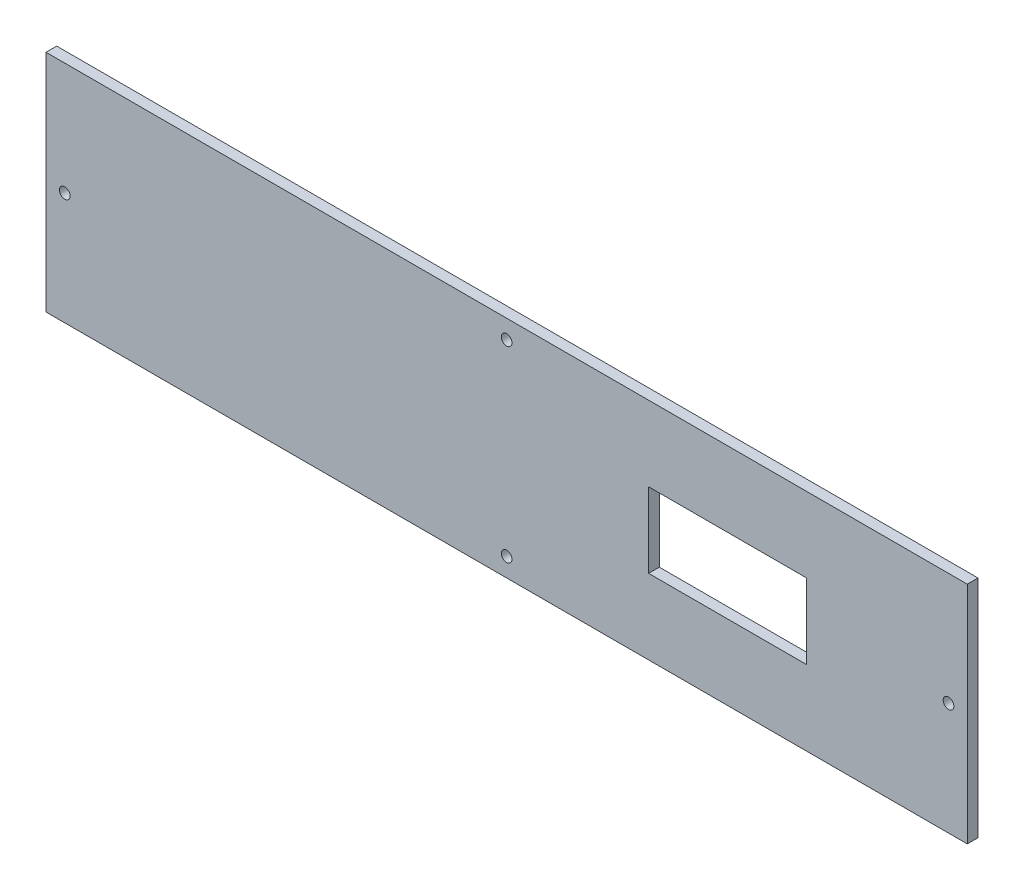
ISO-10303-21;
HEADER;
FILE_DESCRIPTION(('STEP AP214'),'2;1');
FILE_NAME('part.step','',(''),(''),'','','');
FILE_SCHEMA(('AUTOMOTIVE_DESIGN { 1 0 10303 214 1 1 1 1 }'));
ENDSEC;
DATA;
#1=APPLICATION_CONTEXT('core data for automotive mechanical design processes');
#2=APPLICATION_PROTOCOL_DEFINITION('international standard','automotive_design',2000,#1);
#3=PRODUCT_CONTEXT('',#1,'mechanical');
#4=PRODUCT('Part','Part','',(#3));
#5=PRODUCT_RELATED_PRODUCT_CATEGORY('part','',(#4));
#6=PRODUCT_DEFINITION_FORMATION('','',#4);
#7=PRODUCT_DEFINITION_CONTEXT('part definition',#1,'design');
#8=PRODUCT_DEFINITION('design','',#6,#7);
#9=PRODUCT_DEFINITION_SHAPE('','',#8);
#10=(LENGTH_UNIT() NAMED_UNIT(*) SI_UNIT(.MILLI.,.METRE.));
#11=(NAMED_UNIT(*) PLANE_ANGLE_UNIT() SI_UNIT($,.RADIAN.));
#12=(NAMED_UNIT(*) SI_UNIT($,.STERADIAN.) SOLID_ANGLE_UNIT());
#13=UNCERTAINTY_MEASURE_WITH_UNIT(LENGTH_MEASURE(1.E-05),#10,'distance_accuracy_value','');
#14=(GEOMETRIC_REPRESENTATION_CONTEXT(3) GLOBAL_UNCERTAINTY_ASSIGNED_CONTEXT((#13)) GLOBAL_UNIT_ASSIGNED_CONTEXT((#10,
#11,#12)) REPRESENTATION_CONTEXT('',''));
#15=CARTESIAN_POINT('',(0.,0.,0.));
#16=DIRECTION('',(0.,0.,1.));
#17=DIRECTION('',(1.,0.,0.));
#18=AXIS2_PLACEMENT_3D('',#15,#16,#17);
#19=CARTESIAN_POINT('',(0.,0.,4.));
#20=DIRECTION('',(0.,0.,-1.));
#21=DIRECTION('',(-1.,0.,0.));
#22=AXIS2_PLACEMENT_3D('',#19,#20,#21);
#23=PLANE('',#22);
#24=CARTESIAN_POINT('',(337.,42.,4.));
#25=DIRECTION('',(0.,0.,1.));
#26=DIRECTION('',(1.,0.,0.));
#27=AXIS2_PLACEMENT_3D('',#24,#25,#26);
#28=CIRCLE('',#27,2.);
#29=CARTESIAN_POINT('',(339.,42.,4.));
#30=VERTEX_POINT('',#29);
#31=EDGE_CURVE('E138',#30,#30,#28,.T.);
#32=ORIENTED_EDGE('',*,*,#31,.F.);
#33=EDGE_LOOP('',(#32));
#34=FACE_BOUND('',#33,.T.);
#35=CARTESIAN_POINT('',(172.,77.,4.));
#36=DIRECTION('',(0.,0.,1.));
#37=DIRECTION('',(1.,0.,0.));
#38=AXIS2_PLACEMENT_3D('',#35,#36,#37);
#39=CIRCLE('',#38,2.);
#40=CARTESIAN_POINT('',(174.,77.,4.));
#41=VERTEX_POINT('',#40);
#42=EDGE_CURVE('E150',#41,#41,#39,.T.);
#43=ORIENTED_EDGE('',*,*,#42,.F.);
#44=EDGE_LOOP('',(#43));
#45=FACE_BOUND('',#44,.T.);
#46=DIRECTION('',(1.,0.,0.));
#47=VECTOR('',#46,1.);
#48=CARTESIAN_POINT('',(344.,0.,4.));
#49=LINE('',#48,#47);
#50=CARTESIAN_POINT('',(0.,0.,4.));
#51=VERTEX_POINT('',#50);
#52=CARTESIAN_POINT('',(344.,0.,4.));
#53=VERTEX_POINT('',#52);
#54=EDGE_CURVE('E162',#51,#53,#49,.T.);
#55=ORIENTED_EDGE('',*,*,#54,.T.);
#56=DIRECTION('',(0.,1.,0.));
#57=VECTOR('',#56,1.);
#58=CARTESIAN_POINT('',(344.,84.,4.));
#59=LINE('',#58,#57);
#60=CARTESIAN_POINT('',(344.,84.,4.));
#61=VERTEX_POINT('',#60);
#62=EDGE_CURVE('E165',#53,#61,#59,.T.);
#63=ORIENTED_EDGE('',*,*,#62,.T.);
#64=DIRECTION('',(-1.,0.,0.));
#65=VECTOR('',#64,1.);
#66=CARTESIAN_POINT('',(0.,84.,4.));
#67=LINE('',#66,#65);
#68=CARTESIAN_POINT('',(0.,84.,4.));
#69=VERTEX_POINT('',#68);
#70=EDGE_CURVE('E168',#61,#69,#67,.T.);
#71=ORIENTED_EDGE('',*,*,#70,.T.);
#72=DIRECTION('',(0.,-1.,0.));
#73=VECTOR('',#72,1.);
#74=CARTESIAN_POINT('',(0.,0.,4.));
#75=LINE('',#74,#73);
#76=EDGE_CURVE('E170',#69,#51,#75,.T.);
#77=ORIENTED_EDGE('',*,*,#76,.T.);
#78=EDGE_LOOP('',(#55,#63,#71,#77));
#79=FACE_BOUND('',#78,.T.);
#80=CARTESIAN_POINT('',(7.,42.,4.));
#81=DIRECTION('',(0.,0.,1.));
#82=DIRECTION('',(1.,0.,0.));
#83=AXIS2_PLACEMENT_3D('',#80,#81,#82);
#84=CIRCLE('',#83,2.);
#85=CARTESIAN_POINT('',(9.,42.,4.));
#86=VERTEX_POINT('',#85);
#87=EDGE_CURVE('E156',#86,#86,#84,.T.);
#88=ORIENTED_EDGE('',*,*,#87,.F.);
#89=EDGE_LOOP('',(#88));
#90=FACE_BOUND('',#89,.T.);
#91=CARTESIAN_POINT('',(172.,7.00000000000001,4.));
#92=DIRECTION('',(0.,0.,1.));
#93=DIRECTION('',(1.,0.,0.));
#94=AXIS2_PLACEMENT_3D('',#91,#92,#93);
#95=CIRCLE('',#94,2.);
#96=CARTESIAN_POINT('',(174.,7.00000000000001,4.));
#97=VERTEX_POINT('',#96);
#98=EDGE_CURVE('E144',#97,#97,#95,.T.);
#99=ORIENTED_EDGE('',*,*,#98,.F.);
#100=EDGE_LOOP('',(#99));
#101=FACE_BOUND('',#100,.T.);
#102=DIRECTION('',(-1.,0.,0.));
#103=VECTOR('',#102,1.);
#104=CARTESIAN_POINT('',(284.,56.,4.));
#105=LINE('',#104,#103);
#106=CARTESIAN_POINT('',(284.,56.,4.));
#107=VERTEX_POINT('',#106);
#108=CARTESIAN_POINT('',(225.,56.,4.));
#109=VERTEX_POINT('',#108);
#110=EDGE_CURVE('E102',#107,#109,#105,.T.);
#111=ORIENTED_EDGE('',*,*,#110,.F.);
#112=DIRECTION('',(0.,1.,0.));
#113=VECTOR('',#112,1.);
#114=CARTESIAN_POINT('',(284.,28.,4.));
#115=LINE('',#114,#113);
#116=CARTESIAN_POINT('',(284.,28.,4.));
#117=VERTEX_POINT('',#116);
#118=EDGE_CURVE('E124',#117,#107,#115,.T.);
#119=ORIENTED_EDGE('',*,*,#118,.F.);
#120=DIRECTION('',(1.,0.,0.));
#121=VECTOR('',#120,1.);
#122=CARTESIAN_POINT('',(225.,28.,4.));
#123=LINE('',#122,#121);
#124=CARTESIAN_POINT('',(225.,28.,4.));
#125=VERTEX_POINT('',#124);
#126=EDGE_CURVE('E122',#125,#117,#123,.T.);
#127=ORIENTED_EDGE('',*,*,#126,.F.);
#128=DIRECTION('',(0.,-1.,0.));
#129=VECTOR('',#128,1.);
#130=CARTESIAN_POINT('',(225.,56.,4.));
#131=LINE('',#130,#129);
#132=EDGE_CURVE('E110',#109,#125,#131,.T.);
#133=ORIENTED_EDGE('',*,*,#132,.F.);
#134=EDGE_LOOP('',(#111,#119,#127,#133));
#135=FACE_BOUND('',#134,.T.);
#136=ADVANCED_FACE('F37',(#34,#45,#79,#90,#101,#135),#23,.F.);
#137=CARTESIAN_POINT('',(0.,0.,0.));
#138=DIRECTION('',(0.,0.,-1.));
#139=DIRECTION('',(-1.,0.,0.));
#140=AXIS2_PLACEMENT_3D('',#137,#138,#139);
#141=PLANE('',#140);
#142=CARTESIAN_POINT('',(337.,42.,0.));
#143=DIRECTION('',(0.,0.,1.));
#144=DIRECTION('',(1.,0.,0.));
#145=AXIS2_PLACEMENT_3D('',#142,#143,#144);
#146=CIRCLE('',#145,2.);
#147=CARTESIAN_POINT('',(339.,42.,0.));
#148=VERTEX_POINT('',#147);
#149=EDGE_CURVE('E118',#148,#148,#146,.T.);
#150=ORIENTED_EDGE('',*,*,#149,.T.);
#151=EDGE_LOOP('',(#150));
#152=FACE_BOUND('',#151,.T.);
#153=CARTESIAN_POINT('',(172.,77.,0.));
#154=DIRECTION('',(0.,0.,1.));
#155=DIRECTION('',(1.,0.,0.));
#156=AXIS2_PLACEMENT_3D('',#153,#154,#155);
#157=CIRCLE('',#156,2.);
#158=CARTESIAN_POINT('',(174.,77.,0.));
#159=VERTEX_POINT('',#158);
#160=EDGE_CURVE('E147',#159,#159,#157,.T.);
#161=ORIENTED_EDGE('',*,*,#160,.T.);
#162=EDGE_LOOP('',(#161));
#163=FACE_BOUND('',#162,.T.);
#164=DIRECTION('',(1.,0.,0.));
#165=VECTOR('',#164,1.);
#166=CARTESIAN_POINT('',(344.,0.,0.));
#167=LINE('',#166,#165);
#168=CARTESIAN_POINT('',(0.,0.,0.));
#169=VERTEX_POINT('',#168);
#170=CARTESIAN_POINT('',(344.,0.,0.));
#171=VERTEX_POINT('',#170);
#172=EDGE_CURVE('E159',#169,#171,#167,.T.);
#173=ORIENTED_EDGE('',*,*,#172,.F.);
#174=DIRECTION('',(0.,-1.,0.));
#175=VECTOR('',#174,1.);
#176=CARTESIAN_POINT('',(0.,0.,0.));
#177=LINE('',#176,#175);
#178=CARTESIAN_POINT('',(0.,84.,0.));
#179=VERTEX_POINT('',#178);
#180=EDGE_CURVE('E166',#179,#169,#177,.T.);
#181=ORIENTED_EDGE('',*,*,#180,.F.);
#182=DIRECTION('',(-1.,0.,0.));
#183=VECTOR('',#182,1.);
#184=CARTESIAN_POINT('',(0.,84.,0.));
#185=LINE('',#184,#183);
#186=CARTESIAN_POINT('',(344.,84.,0.));
#187=VERTEX_POINT('',#186);
#188=EDGE_CURVE('E177',#187,#179,#185,.T.);
#189=ORIENTED_EDGE('',*,*,#188,.F.);
#190=DIRECTION('',(0.,1.,0.));
#191=VECTOR('',#190,1.);
#192=CARTESIAN_POINT('',(344.,84.,0.));
#193=LINE('',#192,#191);
#194=EDGE_CURVE('E175',#171,#187,#193,.T.);
#195=ORIENTED_EDGE('',*,*,#194,.F.);
#196=EDGE_LOOP('',(#173,#181,#189,#195));
#197=FACE_BOUND('',#196,.T.);
#198=CARTESIAN_POINT('',(7.,42.,0.));
#199=DIRECTION('',(0.,0.,1.));
#200=DIRECTION('',(1.,0.,0.));
#201=AXIS2_PLACEMENT_3D('',#198,#199,#200);
#202=CIRCLE('',#201,2.);
#203=CARTESIAN_POINT('',(9.,42.,0.));
#204=VERTEX_POINT('',#203);
#205=EDGE_CURVE('E153',#204,#204,#202,.T.);
#206=ORIENTED_EDGE('',*,*,#205,.T.);
#207=EDGE_LOOP('',(#206));
#208=FACE_BOUND('',#207,.T.);
#209=CARTESIAN_POINT('',(172.,7.00000000000001,0.));
#210=DIRECTION('',(0.,0.,1.));
#211=DIRECTION('',(1.,0.,0.));
#212=AXIS2_PLACEMENT_3D('',#209,#210,#211);
#213=CIRCLE('',#212,2.);
#214=CARTESIAN_POINT('',(174.,7.00000000000001,0.));
#215=VERTEX_POINT('',#214);
#216=EDGE_CURVE('E141',#215,#215,#213,.T.);
#217=ORIENTED_EDGE('',*,*,#216,.T.);
#218=EDGE_LOOP('',(#217));
#219=FACE_BOUND('',#218,.T.);
#220=DIRECTION('',(0.,1.,0.));
#221=VECTOR('',#220,1.);
#222=CARTESIAN_POINT('',(284.,28.,0.));
#223=LINE('',#222,#221);
#224=CARTESIAN_POINT('',(284.,28.,0.));
#225=VERTEX_POINT('',#224);
#226=CARTESIAN_POINT('',(284.,56.,0.));
#227=VERTEX_POINT('',#226);
#228=EDGE_CURVE('E111',#225,#227,#223,.T.);
#229=ORIENTED_EDGE('',*,*,#228,.T.);
#230=DIRECTION('',(-1.,0.,0.));
#231=VECTOR('',#230,1.);
#232=CARTESIAN_POINT('',(284.,56.,0.));
#233=LINE('',#232,#231);
#234=CARTESIAN_POINT('',(225.,56.,0.));
#235=VERTEX_POINT('',#234);
#236=EDGE_CURVE('E60',#227,#235,#233,.T.);
#237=ORIENTED_EDGE('',*,*,#236,.T.);
#238=DIRECTION('',(0.,-1.,0.));
#239=VECTOR('',#238,1.);
#240=CARTESIAN_POINT('',(225.,56.,0.));
#241=LINE('',#240,#239);
#242=CARTESIAN_POINT('',(225.,28.,0.));
#243=VERTEX_POINT('',#242);
#244=EDGE_CURVE('E117',#235,#243,#241,.T.);
#245=ORIENTED_EDGE('',*,*,#244,.T.);
#246=DIRECTION('',(1.,0.,0.));
#247=VECTOR('',#246,1.);
#248=CARTESIAN_POINT('',(225.,28.,0.));
#249=LINE('',#248,#247);
#250=EDGE_CURVE('E130',#243,#225,#249,.T.);
#251=ORIENTED_EDGE('',*,*,#250,.T.);
#252=EDGE_LOOP('',(#229,#237,#245,#251));
#253=FACE_BOUND('',#252,.T.);
#254=ADVANCED_FACE('F195',(#152,#163,#197,#208,#219,#253),#141,.T.);
#255=CARTESIAN_POINT('',(344.,0.,4.));
#256=DIRECTION('',(0.,1.,0.));
#257=DIRECTION('',(-1.,0.,0.));
#258=AXIS2_PLACEMENT_3D('',#255,#256,#257);
#259=PLANE('',#258);
#260=ORIENTED_EDGE('',*,*,#172,.T.);
#261=DIRECTION('',(0.,0.,-1.));
#262=VECTOR('',#261,1.);
#263=CARTESIAN_POINT('',(344.,0.,4.));
#264=LINE('',#263,#262);
#265=EDGE_CURVE('E11',#53,#171,#264,.T.);
#266=ORIENTED_EDGE('',*,*,#265,.F.);
#267=ORIENTED_EDGE('',*,*,#54,.F.);
#268=DIRECTION('',(0.,0.,-1.));
#269=VECTOR('',#268,1.);
#270=CARTESIAN_POINT('',(0.,0.,4.));
#271=LINE('',#270,#269);
#272=EDGE_CURVE('E172',#51,#169,#271,.T.);
#273=ORIENTED_EDGE('',*,*,#272,.T.);
#274=EDGE_LOOP('',(#260,#266,#267,#273));
#275=FACE_BOUND('',#274,.T.);
#276=ADVANCED_FACE('F39',(#275),#259,.F.);
#277=CARTESIAN_POINT('',(344.,84.,4.));
#278=DIRECTION('',(-1.,0.,0.));
#279=DIRECTION('',(0.,0.,1.));
#280=AXIS2_PLACEMENT_3D('',#277,#278,#279);
#281=PLANE('',#280);
#282=ORIENTED_EDGE('',*,*,#194,.T.);
#283=DIRECTION('',(0.,0.,-1.));
#284=VECTOR('',#283,1.);
#285=CARTESIAN_POINT('',(344.,84.,4.));
#286=LINE('',#285,#284);
#287=EDGE_CURVE('E45',#61,#187,#286,.T.);
#288=ORIENTED_EDGE('',*,*,#287,.F.);
#289=ORIENTED_EDGE('',*,*,#62,.F.);
#290=ORIENTED_EDGE('',*,*,#265,.T.);
#291=EDGE_LOOP('',(#282,#288,#289,#290));
#292=FACE_BOUND('',#291,.T.);
#293=ADVANCED_FACE('F206',(#292),#281,.F.);
#294=CARTESIAN_POINT('',(0.,84.,4.));
#295=DIRECTION('',(0.,-1.,0.));
#296=DIRECTION('',(0.,0.,-1.));
#297=AXIS2_PLACEMENT_3D('',#294,#295,#296);
#298=PLANE('',#297);
#299=ORIENTED_EDGE('',*,*,#188,.T.);
#300=DIRECTION('',(0.,0.,-1.));
#301=VECTOR('',#300,1.);
#302=CARTESIAN_POINT('',(0.,84.,4.));
#303=LINE('',#302,#301);
#304=EDGE_CURVE('E182',#69,#179,#303,.T.);
#305=ORIENTED_EDGE('',*,*,#304,.F.);
#306=ORIENTED_EDGE('',*,*,#70,.F.);
#307=ORIENTED_EDGE('',*,*,#287,.T.);
#308=EDGE_LOOP('',(#299,#305,#306,#307));
#309=FACE_BOUND('',#308,.T.);
#310=ADVANCED_FACE('F189',(#309),#298,.F.);
#311=CARTESIAN_POINT('',(0.,0.,4.));
#312=DIRECTION('',(1.,0.,0.));
#313=DIRECTION('',(0.,0.,-1.));
#314=AXIS2_PLACEMENT_3D('',#311,#312,#313);
#315=PLANE('',#314);
#316=ORIENTED_EDGE('',*,*,#180,.T.);
#317=ORIENTED_EDGE('',*,*,#272,.F.);
#318=ORIENTED_EDGE('',*,*,#76,.F.);
#319=ORIENTED_EDGE('',*,*,#304,.T.);
#320=EDGE_LOOP('',(#316,#317,#318,#319));
#321=FACE_BOUND('',#320,.T.);
#322=ADVANCED_FACE('F199',(#321),#315,.F.);
#323=CARTESIAN_POINT('',(7.,42.,4.));
#324=DIRECTION('',(0.,0.,-1.));
#325=DIRECTION('',(-1.,0.,0.));
#326=AXIS2_PLACEMENT_3D('',#323,#324,#325);
#327=CYLINDRICAL_SURFACE('',#326,2.);
#328=ORIENTED_EDGE('',*,*,#87,.T.);
#329=EDGE_LOOP('',(#328));
#330=FACE_BOUND('',#329,.T.);
#331=ORIENTED_EDGE('',*,*,#205,.F.);
#332=EDGE_LOOP('',(#331));
#333=FACE_BOUND('',#332,.T.);
#334=ADVANCED_FACE('F224',(#330,#333),#327,.F.);
#335=CARTESIAN_POINT('',(172.,77.,4.));
#336=DIRECTION('',(0.,0.,-1.));
#337=DIRECTION('',(-1.,0.,0.));
#338=AXIS2_PLACEMENT_3D('',#335,#336,#337);
#339=CYLINDRICAL_SURFACE('',#338,2.);
#340=ORIENTED_EDGE('',*,*,#42,.T.);
#341=EDGE_LOOP('',(#340));
#342=FACE_BOUND('',#341,.T.);
#343=ORIENTED_EDGE('',*,*,#160,.F.);
#344=EDGE_LOOP('',(#343));
#345=FACE_BOUND('',#344,.T.);
#346=ADVANCED_FACE('F231',(#342,#345),#339,.F.);
#347=CARTESIAN_POINT('',(172.,7.00000000000001,4.));
#348=DIRECTION('',(0.,0.,-1.));
#349=DIRECTION('',(-1.,0.,0.));
#350=AXIS2_PLACEMENT_3D('',#347,#348,#349);
#351=CYLINDRICAL_SURFACE('',#350,2.);
#352=ORIENTED_EDGE('',*,*,#98,.T.);
#353=EDGE_LOOP('',(#352));
#354=FACE_BOUND('',#353,.T.);
#355=ORIENTED_EDGE('',*,*,#216,.F.);
#356=EDGE_LOOP('',(#355));
#357=FACE_BOUND('',#356,.T.);
#358=ADVANCED_FACE('F236',(#354,#357),#351,.F.);
#359=CARTESIAN_POINT('',(337.,42.,4.));
#360=DIRECTION('',(0.,0.,-1.));
#361=DIRECTION('',(-1.,0.,0.));
#362=AXIS2_PLACEMENT_3D('',#359,#360,#361);
#363=CYLINDRICAL_SURFACE('',#362,2.);
#364=ORIENTED_EDGE('',*,*,#31,.T.);
#365=EDGE_LOOP('',(#364));
#366=FACE_BOUND('',#365,.T.);
#367=ORIENTED_EDGE('',*,*,#149,.F.);
#368=EDGE_LOOP('',(#367));
#369=FACE_BOUND('',#368,.T.);
#370=ADVANCED_FACE('F259',(#366,#369),#363,.F.);
#371=CARTESIAN_POINT('',(284.,56.,4.));
#372=DIRECTION('',(0.,-1.,0.));
#373=DIRECTION('',(0.,0.,-1.));
#374=AXIS2_PLACEMENT_3D('',#371,#372,#373);
#375=PLANE('',#374);
#376=ORIENTED_EDGE('',*,*,#236,.F.);
#377=DIRECTION('',(0.,0.,-1.));
#378=VECTOR('',#377,1.);
#379=CARTESIAN_POINT('',(284.,56.,4.));
#380=LINE('',#379,#378);
#381=EDGE_CURVE('E106',#107,#227,#380,.T.);
#382=ORIENTED_EDGE('',*,*,#381,.F.);
#383=ORIENTED_EDGE('',*,*,#110,.T.);
#384=DIRECTION('',(0.,0.,-1.));
#385=VECTOR('',#384,1.);
#386=CARTESIAN_POINT('',(225.,56.,4.));
#387=LINE('',#386,#385);
#388=EDGE_CURVE('E105',#109,#235,#387,.T.);
#389=ORIENTED_EDGE('',*,*,#388,.T.);
#390=EDGE_LOOP('',(#376,#382,#383,#389));
#391=FACE_BOUND('',#390,.T.);
#392=ADVANCED_FACE('F104',(#391),#375,.T.);
#393=CARTESIAN_POINT('',(225.,56.,4.));
#394=DIRECTION('',(1.,0.,0.));
#395=DIRECTION('',(0.,0.,-1.));
#396=AXIS2_PLACEMENT_3D('',#393,#394,#395);
#397=PLANE('',#396);
#398=ORIENTED_EDGE('',*,*,#244,.F.);
#399=ORIENTED_EDGE('',*,*,#388,.F.);
#400=ORIENTED_EDGE('',*,*,#132,.T.);
#401=DIRECTION('',(0.,0.,-1.));
#402=VECTOR('',#401,1.);
#403=CARTESIAN_POINT('',(225.,28.,4.));
#404=LINE('',#403,#402);
#405=EDGE_CURVE('E119',#125,#243,#404,.T.);
#406=ORIENTED_EDGE('',*,*,#405,.T.);
#407=EDGE_LOOP('',(#398,#399,#400,#406));
#408=FACE_BOUND('',#407,.T.);
#409=ADVANCED_FACE('F114',(#408),#397,.T.);
#410=CARTESIAN_POINT('',(225.,28.,4.));
#411=DIRECTION('',(0.,1.,0.));
#412=DIRECTION('',(0.,0.,1.));
#413=AXIS2_PLACEMENT_3D('',#410,#411,#412);
#414=PLANE('',#413);
#415=ORIENTED_EDGE('',*,*,#250,.F.);
#416=ORIENTED_EDGE('',*,*,#405,.F.);
#417=ORIENTED_EDGE('',*,*,#126,.T.);
#418=DIRECTION('',(0.,0.,-1.));
#419=VECTOR('',#418,1.);
#420=CARTESIAN_POINT('',(284.,28.,4.));
#421=LINE('',#420,#419);
#422=EDGE_CURVE('E52',#117,#225,#421,.T.);
#423=ORIENTED_EDGE('',*,*,#422,.T.);
#424=EDGE_LOOP('',(#415,#416,#417,#423));
#425=FACE_BOUND('',#424,.T.);
#426=ADVANCED_FACE('F247',(#425),#414,.T.);
#427=CARTESIAN_POINT('',(284.,28.,4.));
#428=DIRECTION('',(-1.,0.,0.));
#429=DIRECTION('',(0.,0.,1.));
#430=AXIS2_PLACEMENT_3D('',#427,#428,#429);
#431=PLANE('',#430);
#432=ORIENTED_EDGE('',*,*,#228,.F.);
#433=ORIENTED_EDGE('',*,*,#422,.F.);
#434=ORIENTED_EDGE('',*,*,#118,.T.);
#435=ORIENTED_EDGE('',*,*,#381,.T.);
#436=EDGE_LOOP('',(#432,#433,#434,#435));
#437=FACE_BOUND('',#436,.T.);
#438=ADVANCED_FACE('F245',(#437),#431,.T.);
#439=CLOSED_SHELL('',(#136,#254,#276,#293,#310,#322,#334,#346,#358,#370,#392,#409,#426,#438));
#440=MANIFOLD_SOLID_BREP('B2',#439);
#441=ADVANCED_BREP_SHAPE_REPRESENTATION('',(#18,#440),#14);
#442=SHAPE_DEFINITION_REPRESENTATION(#9,#441);
ENDSEC;
END-ISO-10303-21;
